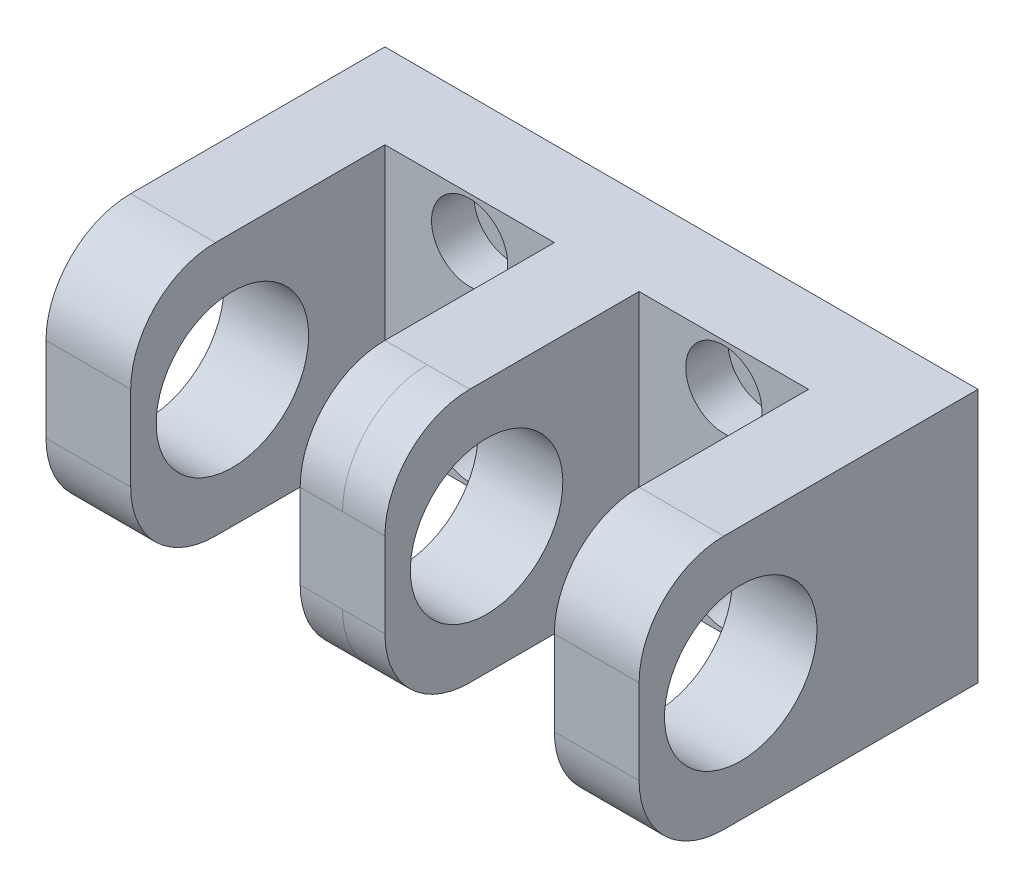
ISO-10303-21;
HEADER;
FILE_DESCRIPTION(('STEP AP214'),'2;1');
FILE_NAME('part.step','',(''),(''),'','','');
FILE_SCHEMA(('AUTOMOTIVE_DESIGN { 1 0 10303 214 1 1 1 1 }'));
ENDSEC;
DATA;
#1=APPLICATION_CONTEXT('core data for automotive mechanical design processes');
#2=APPLICATION_PROTOCOL_DEFINITION('international standard','automotive_design',2000,#1);
#3=PRODUCT_CONTEXT('',#1,'mechanical');
#4=PRODUCT('Part','Part','',(#3));
#5=PRODUCT_RELATED_PRODUCT_CATEGORY('part','',(#4));
#6=PRODUCT_DEFINITION_FORMATION('','',#4);
#7=PRODUCT_DEFINITION_CONTEXT('part definition',#1,'design');
#8=PRODUCT_DEFINITION('design','',#6,#7);
#9=PRODUCT_DEFINITION_SHAPE('','',#8);
#10=(LENGTH_UNIT() NAMED_UNIT(*) SI_UNIT(.MILLI.,.METRE.));
#11=(NAMED_UNIT(*) PLANE_ANGLE_UNIT() SI_UNIT($,.RADIAN.));
#12=(NAMED_UNIT(*) SI_UNIT($,.STERADIAN.) SOLID_ANGLE_UNIT());
#13=UNCERTAINTY_MEASURE_WITH_UNIT(LENGTH_MEASURE(1.E-05),#10,'distance_accuracy_value','');
#14=(GEOMETRIC_REPRESENTATION_CONTEXT(3) GLOBAL_UNCERTAINTY_ASSIGNED_CONTEXT((#13)) GLOBAL_UNIT_ASSIGNED_CONTEXT((#10,
#11,#12)) REPRESENTATION_CONTEXT('',''));
#15=CARTESIAN_POINT('',(0.,0.,0.));
#16=DIRECTION('',(0.,0.,1.));
#17=DIRECTION('',(1.,0.,0.));
#18=AXIS2_PLACEMENT_3D('',#15,#16,#17);
#19=CARTESIAN_POINT('',(-15.,25.,0.));
#20=DIRECTION('',(0.,0.,1.));
#21=DIRECTION('',(1.,0.,0.));
#22=AXIS2_PLACEMENT_3D('',#19,#20,#21);
#23=CYLINDRICAL_SURFACE('',#22,2.5);
#24=CARTESIAN_POINT('',(-15.,25.,0.));
#25=DIRECTION('',(0.,0.,1.));
#26=DIRECTION('',(1.,0.,0.));
#27=AXIS2_PLACEMENT_3D('',#24,#25,#26);
#28=CIRCLE('',#27,2.5);
#29=CARTESIAN_POINT('',(-12.5,25.,0.));
#30=VERTEX_POINT('',#29);
#31=EDGE_CURVE('E772',#30,#30,#28,.T.);
#32=ORIENTED_EDGE('',*,*,#31,.F.);
#33=EDGE_LOOP('',(#32));
#34=FACE_BOUND('',#33,.T.);
#35=CARTESIAN_POINT('',(-15.,25.,5.));
#36=DIRECTION('',(0.,0.,1.));
#37=DIRECTION('',(1.,0.,0.));
#38=AXIS2_PLACEMENT_3D('',#35,#36,#37);
#39=CIRCLE('',#38,2.5);
#40=CARTESIAN_POINT('',(-12.5,25.,5.));
#41=VERTEX_POINT('',#40);
#42=EDGE_CURVE('E750',#41,#41,#39,.T.);
#43=ORIENTED_EDGE('',*,*,#42,.T.);
#44=EDGE_LOOP('',(#43));
#45=FACE_BOUND('',#44,.T.);
#46=ADVANCED_FACE('F45',(#34,#45),#23,.F.);
#47=CARTESIAN_POINT('',(-15.,5.,0.));
#48=DIRECTION('',(0.,0.,1.));
#49=DIRECTION('',(1.,0.,0.));
#50=AXIS2_PLACEMENT_3D('',#47,#48,#49);
#51=CYLINDRICAL_SURFACE('',#50,2.5);
#52=CARTESIAN_POINT('',(-15.,5.,0.));
#53=DIRECTION('',(0.,0.,1.));
#54=DIRECTION('',(1.,0.,0.));
#55=AXIS2_PLACEMENT_3D('',#52,#53,#54);
#56=CIRCLE('',#55,2.5);
#57=CARTESIAN_POINT('',(-12.5,5.,0.));
#58=VERTEX_POINT('',#57);
#59=EDGE_CURVE('E755',#58,#58,#56,.T.);
#60=ORIENTED_EDGE('',*,*,#59,.F.);
#61=EDGE_LOOP('',(#60));
#62=FACE_BOUND('',#61,.T.);
#63=CARTESIAN_POINT('',(-15.,5.,5.));
#64=DIRECTION('',(0.,0.,1.));
#65=DIRECTION('',(1.,0.,0.));
#66=AXIS2_PLACEMENT_3D('',#63,#64,#65);
#67=CIRCLE('',#66,2.5);
#68=CARTESIAN_POINT('',(-12.5,5.,5.));
#69=VERTEX_POINT('',#68);
#70=EDGE_CURVE('E816',#69,#69,#67,.T.);
#71=ORIENTED_EDGE('',*,*,#70,.T.);
#72=EDGE_LOOP('',(#71));
#73=FACE_BOUND('',#72,.T.);
#74=ADVANCED_FACE('F491',(#62,#73),#51,.F.);
#75=CARTESIAN_POINT('',(15.,25.,0.));
#76=DIRECTION('',(0.,0.,1.));
#77=DIRECTION('',(1.,0.,0.));
#78=AXIS2_PLACEMENT_3D('',#75,#76,#77);
#79=CYLINDRICAL_SURFACE('',#78,2.5);
#80=CARTESIAN_POINT('',(15.,25.,0.));
#81=DIRECTION('',(0.,0.,1.));
#82=DIRECTION('',(1.,0.,0.));
#83=AXIS2_PLACEMENT_3D('',#80,#81,#82);
#84=CIRCLE('',#83,2.5);
#85=CARTESIAN_POINT('',(17.5,25.,0.));
#86=VERTEX_POINT('',#85);
#87=EDGE_CURVE('E768',#86,#86,#84,.T.);
#88=ORIENTED_EDGE('',*,*,#87,.F.);
#89=EDGE_LOOP('',(#88));
#90=FACE_BOUND('',#89,.T.);
#91=CARTESIAN_POINT('',(15.,25.,5.));
#92=DIRECTION('',(0.,0.,1.));
#93=DIRECTION('',(1.,0.,0.));
#94=AXIS2_PLACEMENT_3D('',#91,#92,#93);
#95=CIRCLE('',#94,2.5);
#96=CARTESIAN_POINT('',(17.5,25.,5.));
#97=VERTEX_POINT('',#96);
#98=EDGE_CURVE('E835',#97,#97,#95,.T.);
#99=ORIENTED_EDGE('',*,*,#98,.T.);
#100=EDGE_LOOP('',(#99));
#101=FACE_BOUND('',#100,.T.);
#102=ADVANCED_FACE('F498',(#90,#101),#79,.F.);
#103=CARTESIAN_POINT('',(15.,5.,0.));
#104=DIRECTION('',(0.,0.,1.));
#105=DIRECTION('',(1.,0.,0.));
#106=AXIS2_PLACEMENT_3D('',#103,#104,#105);
#107=CYLINDRICAL_SURFACE('',#106,2.5);
#108=CARTESIAN_POINT('',(15.,5.,0.));
#109=DIRECTION('',(0.,0.,1.));
#110=DIRECTION('',(1.,0.,0.));
#111=AXIS2_PLACEMENT_3D('',#108,#109,#110);
#112=CIRCLE('',#111,2.5);
#113=CARTESIAN_POINT('',(17.5,5.,0.));
#114=VERTEX_POINT('',#113);
#115=EDGE_CURVE('E761',#114,#114,#112,.T.);
#116=ORIENTED_EDGE('',*,*,#115,.F.);
#117=EDGE_LOOP('',(#116));
#118=FACE_BOUND('',#117,.T.);
#119=CARTESIAN_POINT('',(15.,5.,5.));
#120=DIRECTION('',(0.,0.,1.));
#121=DIRECTION('',(1.,0.,0.));
#122=AXIS2_PLACEMENT_3D('',#119,#120,#121);
#123=CIRCLE('',#122,2.5);
#124=CARTESIAN_POINT('',(17.5,5.,5.));
#125=VERTEX_POINT('',#124);
#126=EDGE_CURVE('E797',#125,#125,#123,.T.);
#127=ORIENTED_EDGE('',*,*,#126,.T.);
#128=EDGE_LOOP('',(#127));
#129=FACE_BOUND('',#128,.T.);
#130=ADVANCED_FACE('F536',(#118,#129),#107,.F.);
#131=CARTESIAN_POINT('',(0.,0.,10.));
#132=DIRECTION('',(0.,0.,-1.));
#133=DIRECTION('',(-1.,0.,0.));
#134=AXIS2_PLACEMENT_3D('',#131,#132,#133);
#135=PLANE('',#134);
#136=CARTESIAN_POINT('',(15.,5.,10.));
#137=DIRECTION('',(0.,0.,1.));
#138=DIRECTION('',(1.,0.,0.));
#139=AXIS2_PLACEMENT_3D('',#136,#137,#138);
#140=CIRCLE('',#139,4.5);
#141=CARTESIAN_POINT('',(19.5,5.,10.));
#142=VERTEX_POINT('',#141);
#143=EDGE_CURVE('E800',#142,#142,#140,.T.);
#144=ORIENTED_EDGE('',*,*,#143,.F.);
#145=EDGE_LOOP('',(#144));
#146=FACE_BOUND('',#145,.T.);
#147=CARTESIAN_POINT('',(15.,25.,10.));
#148=DIRECTION('',(0.,0.,1.));
#149=DIRECTION('',(1.,0.,0.));
#150=AXIS2_PLACEMENT_3D('',#147,#148,#149);
#151=CIRCLE('',#150,4.5);
#152=CARTESIAN_POINT('',(19.5,25.,10.));
#153=VERTEX_POINT('',#152);
#154=EDGE_CURVE('E805',#153,#153,#151,.T.);
#155=ORIENTED_EDGE('',*,*,#154,.F.);
#156=EDGE_LOOP('',(#155));
#157=FACE_BOUND('',#156,.T.);
#158=DIRECTION('',(0.,-1.,0.));
#159=VECTOR('',#158,1.);
#160=CARTESIAN_POINT('',(25.,0.,10.));
#161=LINE('',#160,#159);
#162=CARTESIAN_POINT('',(25.,30.,10.));
#163=VERTEX_POINT('',#162);
#164=CARTESIAN_POINT('',(25.,0.,10.));
#165=VERTEX_POINT('',#164);
#166=EDGE_CURVE('E251',#163,#165,#161,.T.);
#167=ORIENTED_EDGE('',*,*,#166,.F.);
#168=DIRECTION('',(-1.,0.,0.));
#169=VECTOR('',#168,1.);
#170=CARTESIAN_POINT('',(0.,30.,10.));
#171=LINE('',#170,#169);
#172=CARTESIAN_POINT('',(5.,30.,10.));
#173=VERTEX_POINT('',#172);
#174=EDGE_CURVE('E281',#163,#173,#171,.T.);
#175=ORIENTED_EDGE('',*,*,#174,.T.);
#176=DIRECTION('',(0.,1.,0.));
#177=VECTOR('',#176,1.);
#178=CARTESIAN_POINT('',(5.,30.,10.));
#179=LINE('',#178,#177);
#180=CARTESIAN_POINT('',(5.,0.,10.));
#181=VERTEX_POINT('',#180);
#182=EDGE_CURVE('E255',#181,#173,#179,.T.);
#183=ORIENTED_EDGE('',*,*,#182,.F.);
#184=DIRECTION('',(1.,0.,0.));
#185=VECTOR('',#184,1.);
#186=CARTESIAN_POINT('',(0.,0.,10.));
#187=LINE('',#186,#185);
#188=EDGE_CURVE('E277',#181,#165,#187,.T.);
#189=ORIENTED_EDGE('',*,*,#188,.T.);
#190=EDGE_LOOP('',(#167,#175,#183,#189));
#191=FACE_BOUND('',#190,.T.);
#192=ADVANCED_FACE('F437',(#146,#157,#191),#135,.F.);
#193=CARTESIAN_POINT('',(0.,0.,10.));
#194=DIRECTION('',(0.,1.,0.));
#195=DIRECTION('',(0.,0.,1.));
#196=AXIS2_PLACEMENT_3D('',#193,#194,#195);
#197=PLANE('',#196);
#198=DIRECTION('',(0.,0.,-1.));
#199=VECTOR('',#198,1.);
#200=CARTESIAN_POINT('',(-25.,0.,40.));
#201=LINE('',#200,#199);
#202=CARTESIAN_POINT('',(-25.,0.,30.));
#203=VERTEX_POINT('',#202);
#204=CARTESIAN_POINT('',(-25.,0.,10.));
#205=VERTEX_POINT('',#204);
#206=EDGE_CURVE('E185',#203,#205,#201,.T.);
#207=ORIENTED_EDGE('',*,*,#206,.F.);
#208=DIRECTION('',(-1.,0.,0.));
#209=VECTOR('',#208,1.);
#210=CARTESIAN_POINT('',(-35.,0.,30.));
#211=LINE('',#210,#209);
#212=CARTESIAN_POINT('',(-35.,0.,30.));
#213=VERTEX_POINT('',#212);
#214=EDGE_CURVE('E365',#203,#213,#211,.T.);
#215=ORIENTED_EDGE('',*,*,#214,.T.);
#216=DIRECTION('',(0.,0.,-1.));
#217=VECTOR('',#216,1.);
#218=CARTESIAN_POINT('',(-35.,0.,10.));
#219=LINE('',#218,#217);
#220=CARTESIAN_POINT('',(-35.,0.,0.));
#221=VERTEX_POINT('',#220);
#222=EDGE_CURVE('E219',#213,#221,#219,.T.);
#223=ORIENTED_EDGE('',*,*,#222,.T.);
#224=DIRECTION('',(1.,0.,0.));
#225=VECTOR('',#224,1.);
#226=CARTESIAN_POINT('',(0.,0.,0.));
#227=LINE('',#226,#225);
#228=CARTESIAN_POINT('',(35.,0.,0.));
#229=VERTEX_POINT('',#228);
#230=EDGE_CURVE('E276',#221,#229,#227,.T.);
#231=ORIENTED_EDGE('',*,*,#230,.T.);
#232=DIRECTION('',(0.,0.,-1.));
#233=VECTOR('',#232,1.);
#234=CARTESIAN_POINT('',(35.,0.,10.));
#235=LINE('',#234,#233);
#236=CARTESIAN_POINT('',(35.,0.,30.));
#237=VERTEX_POINT('',#236);
#238=EDGE_CURVE('E299',#237,#229,#235,.T.);
#239=ORIENTED_EDGE('',*,*,#238,.F.);
#240=DIRECTION('',(1.,0.,0.));
#241=VECTOR('',#240,1.);
#242=CARTESIAN_POINT('',(25.,0.,30.));
#243=LINE('',#242,#241);
#244=CARTESIAN_POINT('',(25.,0.,30.));
#245=VERTEX_POINT('',#244);
#246=EDGE_CURVE('E322',#237,#245,#243,.F.);
#247=ORIENTED_EDGE('',*,*,#246,.T.);
#248=DIRECTION('',(0.,0.,-1.));
#249=VECTOR('',#248,1.);
#250=CARTESIAN_POINT('',(25.,0.,40.));
#251=LINE('',#250,#249);
#252=EDGE_CURVE('E247',#245,#165,#251,.T.);
#253=ORIENTED_EDGE('',*,*,#252,.T.);
#254=ORIENTED_EDGE('',*,*,#188,.F.);
#255=DIRECTION('',(0.,0.,-1.));
#256=VECTOR('',#255,1.);
#257=CARTESIAN_POINT('',(5.,0.,40.));
#258=LINE('',#257,#256);
#259=CARTESIAN_POINT('',(5.,0.,30.));
#260=VERTEX_POINT('',#259);
#261=EDGE_CURVE('E273',#260,#181,#258,.T.);
#262=ORIENTED_EDGE('',*,*,#261,.F.);
#263=DIRECTION('',(1.,0.,0.));
#264=VECTOR('',#263,1.);
#265=CARTESIAN_POINT('',(0.,0.,30.));
#266=LINE('',#265,#264);
#267=CARTESIAN_POINT('',(0.,0.,30.));
#268=VERTEX_POINT('',#267);
#269=EDGE_CURVE('E319',#260,#268,#266,.F.);
#270=ORIENTED_EDGE('',*,*,#269,.T.);
#271=DIRECTION('',(-1.,0.,0.));
#272=VECTOR('',#271,1.);
#273=CARTESIAN_POINT('',(-5.,0.,30.));
#274=LINE('',#273,#272);
#275=CARTESIAN_POINT('',(-5.,0.,30.));
#276=VERTEX_POINT('',#275);
#277=EDGE_CURVE('E357',#268,#276,#274,.T.);
#278=ORIENTED_EDGE('',*,*,#277,.T.);
#279=DIRECTION('',(0.,0.,-1.));
#280=VECTOR('',#279,1.);
#281=CARTESIAN_POINT('',(-5.,0.,40.));
#282=LINE('',#281,#280);
#283=CARTESIAN_POINT('',(-5.,0.,10.));
#284=VERTEX_POINT('',#283);
#285=EDGE_CURVE('E216',#276,#284,#282,.T.);
#286=ORIENTED_EDGE('',*,*,#285,.T.);
#287=DIRECTION('',(-1.,0.,0.));
#288=VECTOR('',#287,1.);
#289=CARTESIAN_POINT('',(0.,0.,10.));
#290=LINE('',#289,#288);
#291=EDGE_CURVE('E206',#284,#205,#290,.T.);
#292=ORIENTED_EDGE('',*,*,#291,.T.);
#293=EDGE_LOOP('',(#207,#215,#223,#231,#239,#247,#253,#254,#262,#270,#278,#286,#292));
#294=FACE_BOUND('',#293,.T.);
#295=ADVANCED_FACE('F213',(#294),#197,.F.);
#296=CARTESIAN_POINT('',(35.,0.,10.));
#297=DIRECTION('',(-1.,0.,0.));
#298=DIRECTION('',(0.,0.,1.));
#299=AXIS2_PLACEMENT_3D('',#296,#297,#298);
#300=PLANE('',#299);
#301=CARTESIAN_POINT('',(35.,15.,28.));
#302=DIRECTION('',(1.,0.,0.));
#303=DIRECTION('',(0.,0.,-1.));
#304=AXIS2_PLACEMENT_3D('',#301,#302,#303);
#305=CIRCLE('',#304,9.00000000000001);
#306=CARTESIAN_POINT('',(35.,15.,19.));
#307=VERTEX_POINT('',#306);
#308=EDGE_CURVE('E235',#307,#307,#305,.T.);
#309=ORIENTED_EDGE('',*,*,#308,.F.);
#310=EDGE_LOOP('',(#309));
#311=FACE_BOUND('',#310,.T.);
#312=DIRECTION('',(0.,1.,0.));
#313=VECTOR('',#312,1.);
#314=CARTESIAN_POINT('',(35.,0.,40.));
#315=LINE('',#314,#313);
#316=CARTESIAN_POINT('',(35.,10.,40.));
#317=VERTEX_POINT('',#316);
#318=CARTESIAN_POINT('',(35.,20.,40.));
#319=VERTEX_POINT('',#318);
#320=EDGE_CURVE('E256',#317,#319,#315,.T.);
#321=ORIENTED_EDGE('',*,*,#320,.F.);
#322=CARTESIAN_POINT('',(35.,10.,30.));
#323=DIRECTION('',(-1.,0.,0.));
#324=DIRECTION('',(0.,0.,1.));
#325=AXIS2_PLACEMENT_3D('',#322,#323,#324);
#326=CIRCLE('',#325,10.);
#327=EDGE_CURVE('E316',#317,#237,#326,.F.);
#328=ORIENTED_EDGE('',*,*,#327,.T.);
#329=ORIENTED_EDGE('',*,*,#238,.T.);
#330=DIRECTION('',(0.,1.,0.));
#331=VECTOR('',#330,1.);
#332=CARTESIAN_POINT('',(35.,0.,0.));
#333=LINE('',#332,#331);
#334=CARTESIAN_POINT('',(35.,30.,0.));
#335=VERTEX_POINT('',#334);
#336=EDGE_CURVE('E290',#229,#335,#333,.T.);
#337=ORIENTED_EDGE('',*,*,#336,.T.);
#338=DIRECTION('',(0.,0.,-1.));
#339=VECTOR('',#338,1.);
#340=CARTESIAN_POINT('',(35.,30.,10.));
#341=LINE('',#340,#339);
#342=CARTESIAN_POINT('',(35.,30.,30.));
#343=VERTEX_POINT('',#342);
#344=EDGE_CURVE('E286',#343,#335,#341,.T.);
#345=ORIENTED_EDGE('',*,*,#344,.F.);
#346=CARTESIAN_POINT('',(35.,20.,30.));
#347=DIRECTION('',(-1.,0.,0.));
#348=DIRECTION('',(0.,0.,1.));
#349=AXIS2_PLACEMENT_3D('',#346,#347,#348);
#350=CIRCLE('',#349,10.);
#351=EDGE_CURVE('E313',#343,#319,#350,.F.);
#352=ORIENTED_EDGE('',*,*,#351,.T.);
#353=EDGE_LOOP('',(#321,#328,#329,#337,#345,#352));
#354=FACE_BOUND('',#353,.T.);
#355=ADVANCED_FACE('F452',(#311,#354),#300,.F.);
#356=CARTESIAN_POINT('',(0.,30.,10.));
#357=DIRECTION('',(0.,-1.,0.));
#358=DIRECTION('',(0.,0.,-1.));
#359=AXIS2_PLACEMENT_3D('',#356,#357,#358);
#360=PLANE('',#359);
#361=DIRECTION('',(0.,0.,-1.));
#362=VECTOR('',#361,1.);
#363=CARTESIAN_POINT('',(-5.,30.,40.));
#364=LINE('',#363,#362);
#365=CARTESIAN_POINT('',(-5.,30.,30.));
#366=VERTEX_POINT('',#365);
#367=CARTESIAN_POINT('',(-5.,30.,10.));
#368=VERTEX_POINT('',#367);
#369=EDGE_CURVE('E231',#366,#368,#364,.T.);
#370=ORIENTED_EDGE('',*,*,#369,.F.);
#371=DIRECTION('',(1.,0.,0.));
#372=VECTOR('',#371,1.);
#373=CARTESIAN_POINT('',(0.,30.,30.));
#374=LINE('',#373,#372);
#375=CARTESIAN_POINT('',(0.,30.,30.));
#376=VERTEX_POINT('',#375);
#377=EDGE_CURVE('E11',#366,#376,#374,.T.);
#378=ORIENTED_EDGE('',*,*,#377,.T.);
#379=DIRECTION('',(-1.,0.,0.));
#380=VECTOR('',#379,1.);
#381=CARTESIAN_POINT('',(5.,30.,30.));
#382=LINE('',#381,#380);
#383=CARTESIAN_POINT('',(5.,30.,30.));
#384=VERTEX_POINT('',#383);
#385=EDGE_CURVE('E354',#376,#384,#382,.F.);
#386=ORIENTED_EDGE('',*,*,#385,.T.);
#387=DIRECTION('',(0.,0.,-1.));
#388=VECTOR('',#387,1.);
#389=CARTESIAN_POINT('',(5.,30.,40.));
#390=LINE('',#389,#388);
#391=EDGE_CURVE('E267',#384,#173,#390,.T.);
#392=ORIENTED_EDGE('',*,*,#391,.T.);
#393=ORIENTED_EDGE('',*,*,#174,.F.);
#394=DIRECTION('',(0.,0.,-1.));
#395=VECTOR('',#394,1.);
#396=CARTESIAN_POINT('',(25.,30.,40.));
#397=LINE('',#396,#395);
#398=CARTESIAN_POINT('',(25.,30.,30.));
#399=VERTEX_POINT('',#398);
#400=EDGE_CURVE('E244',#399,#163,#397,.T.);
#401=ORIENTED_EDGE('',*,*,#400,.F.);
#402=DIRECTION('',(-1.,0.,0.));
#403=VECTOR('',#402,1.);
#404=CARTESIAN_POINT('',(35.,30.,30.));
#405=LINE('',#404,#403);
#406=EDGE_CURVE('E351',#399,#343,#405,.F.);
#407=ORIENTED_EDGE('',*,*,#406,.T.);
#408=ORIENTED_EDGE('',*,*,#344,.T.);
#409=DIRECTION('',(-1.,0.,0.));
#410=VECTOR('',#409,1.);
#411=CARTESIAN_POINT('',(0.,30.,0.));
#412=LINE('',#411,#410);
#413=CARTESIAN_POINT('',(-35.,30.,0.));
#414=VERTEX_POINT('',#413);
#415=EDGE_CURVE('E282',#335,#414,#412,.T.);
#416=ORIENTED_EDGE('',*,*,#415,.T.);
#417=DIRECTION('',(0.,0.,-1.));
#418=VECTOR('',#417,1.);
#419=CARTESIAN_POINT('',(-35.,30.,10.));
#420=LINE('',#419,#418);
#421=CARTESIAN_POINT('',(-35.,30.,30.));
#422=VERTEX_POINT('',#421);
#423=EDGE_CURVE('E223',#422,#414,#420,.T.);
#424=ORIENTED_EDGE('',*,*,#423,.F.);
#425=DIRECTION('',(1.,0.,0.));
#426=VECTOR('',#425,1.);
#427=CARTESIAN_POINT('',(-25.,30.,30.));
#428=LINE('',#427,#426);
#429=CARTESIAN_POINT('',(-25.,30.,30.));
#430=VERTEX_POINT('',#429);
#431=EDGE_CURVE('E54',#422,#430,#428,.T.);
#432=ORIENTED_EDGE('',*,*,#431,.T.);
#433=DIRECTION('',(0.,0.,-1.));
#434=VECTOR('',#433,1.);
#435=CARTESIAN_POINT('',(-25.,30.,40.));
#436=LINE('',#435,#434);
#437=CARTESIAN_POINT('',(-25.,30.,10.));
#438=VERTEX_POINT('',#437);
#439=EDGE_CURVE('E200',#430,#438,#436,.T.);
#440=ORIENTED_EDGE('',*,*,#439,.T.);
#441=DIRECTION('',(1.,0.,0.));
#442=VECTOR('',#441,1.);
#443=CARTESIAN_POINT('',(0.,30.,10.));
#444=LINE('',#443,#442);
#445=EDGE_CURVE('E208',#438,#368,#444,.T.);
#446=ORIENTED_EDGE('',*,*,#445,.T.);
#447=EDGE_LOOP('',(#370,#378,#386,#392,#393,#401,#407,#408,#416,#424,#432,#440,#446));
#448=FACE_BOUND('',#447,.T.);
#449=ADVANCED_FACE('F399',(#448),#360,.F.);
#450=CARTESIAN_POINT('',(0.,0.,0.));
#451=DIRECTION('',(0.,0.,-1.));
#452=DIRECTION('',(-1.,0.,0.));
#453=AXIS2_PLACEMENT_3D('',#450,#451,#452);
#454=PLANE('',#453);
#455=ORIENTED_EDGE('',*,*,#59,.T.);
#456=EDGE_LOOP('',(#455));
#457=FACE_BOUND('',#456,.T.);
#458=ORIENTED_EDGE('',*,*,#115,.T.);
#459=EDGE_LOOP('',(#458));
#460=FACE_BOUND('',#459,.T.);
#461=ORIENTED_EDGE('',*,*,#87,.T.);
#462=EDGE_LOOP('',(#461));
#463=FACE_BOUND('',#462,.T.);
#464=ORIENTED_EDGE('',*,*,#31,.T.);
#465=EDGE_LOOP('',(#464));
#466=FACE_BOUND('',#465,.T.);
#467=ORIENTED_EDGE('',*,*,#230,.F.);
#468=DIRECTION('',(0.,1.,0.));
#469=VECTOR('',#468,1.);
#470=CARTESIAN_POINT('',(-35.,0.,0.));
#471=LINE('',#470,#469);
#472=EDGE_CURVE('E225',#221,#414,#471,.T.);
#473=ORIENTED_EDGE('',*,*,#472,.T.);
#474=ORIENTED_EDGE('',*,*,#415,.F.);
#475=ORIENTED_EDGE('',*,*,#336,.F.);
#476=EDGE_LOOP('',(#467,#473,#474,#475));
#477=FACE_BOUND('',#476,.T.);
#478=ADVANCED_FACE('F466',(#457,#460,#463,#466,#477),#454,.T.);
#479=CARTESIAN_POINT('',(5.,30.,40.));
#480=DIRECTION('',(-1.,0.,0.));
#481=DIRECTION('',(0.,-1.,0.));
#482=AXIS2_PLACEMENT_3D('',#479,#480,#481);
#483=PLANE('',#482);
#484=CARTESIAN_POINT('',(5.,15.,28.));
#485=DIRECTION('',(-1.,0.,0.));
#486=DIRECTION('',(0.,-1.,0.));
#487=AXIS2_PLACEMENT_3D('',#484,#485,#486);
#488=CIRCLE('',#487,9.00000000000001);
#489=CARTESIAN_POINT('',(5.,5.99999999999999,28.));
#490=VERTEX_POINT('',#489);
#491=EDGE_CURVE('E240',#490,#490,#488,.T.);
#492=ORIENTED_EDGE('',*,*,#491,.T.);
#493=EDGE_LOOP('',(#492));
#494=FACE_BOUND('',#493,.T.);
#495=DIRECTION('',(0.,1.,0.));
#496=VECTOR('',#495,1.);
#497=CARTESIAN_POINT('',(5.,30.,40.));
#498=LINE('',#497,#496);
#499=CARTESIAN_POINT('',(5.,10.,40.));
#500=VERTEX_POINT('',#499);
#501=CARTESIAN_POINT('',(5.,20.,40.));
#502=VERTEX_POINT('',#501);
#503=EDGE_CURVE('E263',#500,#502,#498,.T.);
#504=ORIENTED_EDGE('',*,*,#503,.F.);
#505=CARTESIAN_POINT('',(5.,10.,30.));
#506=DIRECTION('',(-1.,0.,0.));
#507=DIRECTION('',(0.,-1.,0.));
#508=AXIS2_PLACEMENT_3D('',#505,#506,#507);
#509=CIRCLE('',#508,10.);
#510=EDGE_CURVE('E341',#500,#260,#509,.F.);
#511=ORIENTED_EDGE('',*,*,#510,.T.);
#512=ORIENTED_EDGE('',*,*,#261,.T.);
#513=ORIENTED_EDGE('',*,*,#182,.T.);
#514=ORIENTED_EDGE('',*,*,#391,.F.);
#515=CARTESIAN_POINT('',(5.,20.,30.));
#516=DIRECTION('',(-1.,0.,0.));
#517=DIRECTION('',(0.,-1.,0.));
#518=AXIS2_PLACEMENT_3D('',#515,#516,#517);
#519=CIRCLE('',#518,10.);
#520=EDGE_CURVE('E338',#384,#502,#519,.F.);
#521=ORIENTED_EDGE('',*,*,#520,.T.);
#522=EDGE_LOOP('',(#504,#511,#512,#513,#514,#521));
#523=FACE_BOUND('',#522,.T.);
#524=ADVANCED_FACE('F429',(#494,#523),#483,.F.);
#525=CARTESIAN_POINT('',(0.,0.,40.));
#526=DIRECTION('',(0.,0.,1.));
#527=DIRECTION('',(1.,0.,0.));
#528=AXIS2_PLACEMENT_3D('',#525,#526,#527);
#529=PLANE('',#528);
#530=DIRECTION('',(0.,1.,0.));
#531=VECTOR('',#530,1.);
#532=CARTESIAN_POINT('',(-5.,30.,40.));
#533=LINE('',#532,#531);
#534=CARTESIAN_POINT('',(-5.,10.,40.));
#535=VERTEX_POINT('',#534);
#536=CARTESIAN_POINT('',(-5.,20.,40.));
#537=VERTEX_POINT('',#536);
#538=EDGE_CURVE('E409',#535,#537,#533,.T.);
#539=ORIENTED_EDGE('',*,*,#538,.F.);
#540=DIRECTION('',(-1.,0.,0.));
#541=VECTOR('',#540,1.);
#542=CARTESIAN_POINT('',(0.,10.,40.));
#543=LINE('',#542,#541);
#544=CARTESIAN_POINT('',(0.,10.,40.));
#545=VERTEX_POINT('',#544);
#546=EDGE_CURVE('E392',#535,#545,#543,.F.);
#547=ORIENTED_EDGE('',*,*,#546,.T.);
#548=DIRECTION('',(1.,0.,0.));
#549=VECTOR('',#548,1.);
#550=CARTESIAN_POINT('',(5.,10.,40.));
#551=LINE('',#550,#549);
#552=EDGE_CURVE('E334',#545,#500,#551,.T.);
#553=ORIENTED_EDGE('',*,*,#552,.T.);
#554=ORIENTED_EDGE('',*,*,#503,.T.);
#555=DIRECTION('',(-1.,0.,0.));
#556=VECTOR('',#555,1.);
#557=CARTESIAN_POINT('',(0.,20.,40.));
#558=LINE('',#557,#556);
#559=CARTESIAN_POINT('',(0.,20.,40.));
#560=VERTEX_POINT('',#559);
#561=EDGE_CURVE('E331',#502,#560,#558,.T.);
#562=ORIENTED_EDGE('',*,*,#561,.T.);
#563=DIRECTION('',(1.,0.,0.));
#564=VECTOR('',#563,1.);
#565=CARTESIAN_POINT('',(-5.,20.,40.));
#566=LINE('',#565,#564);
#567=EDGE_CURVE('E69',#560,#537,#566,.F.);
#568=ORIENTED_EDGE('',*,*,#567,.T.);
#569=EDGE_LOOP('',(#539,#547,#553,#554,#562,#568));
#570=FACE_BOUND('',#569,.T.);
#571=ADVANCED_FACE('F425',(#570),#529,.T.);
#572=CARTESIAN_POINT('',(25.,0.,40.));
#573=DIRECTION('',(1.,0.,0.));
#574=DIRECTION('',(0.,0.,-1.));
#575=AXIS2_PLACEMENT_3D('',#572,#573,#574);
#576=PLANE('',#575);
#577=CARTESIAN_POINT('',(25.,15.,28.));
#578=DIRECTION('',(1.,0.,0.));
#579=DIRECTION('',(0.,0.,-1.));
#580=AXIS2_PLACEMENT_3D('',#577,#578,#579);
#581=CIRCLE('',#580,9.00000000000001);
#582=CARTESIAN_POINT('',(25.,15.,19.));
#583=VERTEX_POINT('',#582);
#584=EDGE_CURVE('E239',#583,#583,#581,.T.);
#585=ORIENTED_EDGE('',*,*,#584,.T.);
#586=EDGE_LOOP('',(#585));
#587=FACE_BOUND('',#586,.T.);
#588=ORIENTED_EDGE('',*,*,#252,.F.);
#589=CARTESIAN_POINT('',(25.,10.,30.));
#590=DIRECTION('',(1.,0.,0.));
#591=DIRECTION('',(0.,0.,-1.));
#592=AXIS2_PLACEMENT_3D('',#589,#590,#591);
#593=CIRCLE('',#592,10.);
#594=CARTESIAN_POINT('',(25.,10.,40.));
#595=VERTEX_POINT('',#594);
#596=EDGE_CURVE('E328',#245,#595,#593,.F.);
#597=ORIENTED_EDGE('',*,*,#596,.T.);
#598=DIRECTION('',(0.,-1.,0.));
#599=VECTOR('',#598,1.);
#600=CARTESIAN_POINT('',(25.,0.,40.));
#601=LINE('',#600,#599);
#602=CARTESIAN_POINT('',(25.,20.,40.));
#603=VERTEX_POINT('',#602);
#604=EDGE_CURVE('E250',#603,#595,#601,.T.);
#605=ORIENTED_EDGE('',*,*,#604,.F.);
#606=CARTESIAN_POINT('',(25.,20.,30.));
#607=DIRECTION('',(1.,0.,0.));
#608=DIRECTION('',(0.,0.,-1.));
#609=AXIS2_PLACEMENT_3D('',#606,#607,#608);
#610=CIRCLE('',#609,10.);
#611=EDGE_CURVE('E325',#603,#399,#610,.F.);
#612=ORIENTED_EDGE('',*,*,#611,.T.);
#613=ORIENTED_EDGE('',*,*,#400,.T.);
#614=ORIENTED_EDGE('',*,*,#166,.T.);
#615=EDGE_LOOP('',(#588,#597,#605,#612,#613,#614));
#616=FACE_BOUND('',#615,.T.);
#617=ADVANCED_FACE('F441',(#587,#616),#576,.F.);
#618=CARTESIAN_POINT('',(0.,0.,40.));
#619=DIRECTION('',(0.,0.,1.));
#620=DIRECTION('',(1.,0.,0.));
#621=AXIS2_PLACEMENT_3D('',#618,#619,#620);
#622=PLANE('',#621);
#623=ORIENTED_EDGE('',*,*,#604,.T.);
#624=DIRECTION('',(1.,0.,0.));
#625=VECTOR('',#624,1.);
#626=CARTESIAN_POINT('',(35.,10.,40.));
#627=LINE('',#626,#625);
#628=EDGE_CURVE('E309',#595,#317,#627,.T.);
#629=ORIENTED_EDGE('',*,*,#628,.T.);
#630=ORIENTED_EDGE('',*,*,#320,.T.);
#631=DIRECTION('',(-1.,0.,0.));
#632=VECTOR('',#631,1.);
#633=CARTESIAN_POINT('',(25.,20.,40.));
#634=LINE('',#633,#632);
#635=EDGE_CURVE('E302',#319,#603,#634,.T.);
#636=ORIENTED_EDGE('',*,*,#635,.T.);
#637=EDGE_LOOP('',(#623,#629,#630,#636));
#638=FACE_BOUND('',#637,.T.);
#639=ADVANCED_FACE('F454',(#638),#622,.T.);
#640=CARTESIAN_POINT('',(0.,15.,28.));
#641=DIRECTION('',(1.,0.,0.));
#642=DIRECTION('',(0.,0.,-1.));
#643=AXIS2_PLACEMENT_3D('',#640,#641,#642);
#644=CYLINDRICAL_SURFACE('',#643,9.00000000000001);
#645=ORIENTED_EDGE('',*,*,#308,.T.);
#646=EDGE_LOOP('',(#645));
#647=FACE_BOUND('',#646,.T.);
#648=ORIENTED_EDGE('',*,*,#584,.F.);
#649=EDGE_LOOP('',(#648));
#650=FACE_BOUND('',#649,.T.);
#651=ADVANCED_FACE('F522',(#647,#650),#644,.F.);
#652=ORIENTED_EDGE('',*,*,#491,.F.);
#653=EDGE_LOOP('',(#652));
#654=FACE_BOUND('',#653,.T.);
#655=CARTESIAN_POINT('',(-5.,15.,28.));
#656=DIRECTION('',(-1.,0.,0.));
#657=DIRECTION('',(0.,-1.,0.));
#658=AXIS2_PLACEMENT_3D('',#655,#656,#657);
#659=CIRCLE('',#658,9.00000000000001);
#660=CARTESIAN_POINT('',(-5.,5.99999999999999,28.));
#661=VERTEX_POINT('',#660);
#662=EDGE_CURVE('E211',#661,#661,#659,.F.);
#663=ORIENTED_EDGE('',*,*,#662,.F.);
#664=EDGE_LOOP('',(#663));
#665=FACE_BOUND('',#664,.T.);
#666=ADVANCED_FACE('F519',(#654,#665),#644,.F.);
#667=CARTESIAN_POINT('',(0.,10.,30.));
#668=DIRECTION('',(-1.,0.,0.));
#669=DIRECTION('',(0.,0.,1.));
#670=AXIS2_PLACEMENT_3D('',#667,#668,#669);
#671=CYLINDRICAL_SURFACE('',#670,10.);
#672=ORIENTED_EDGE('',*,*,#596,.F.);
#673=ORIENTED_EDGE('',*,*,#246,.F.);
#674=ORIENTED_EDGE('',*,*,#327,.F.);
#675=ORIENTED_EDGE('',*,*,#628,.F.);
#676=EDGE_LOOP('',(#672,#673,#674,#675));
#677=FACE_BOUND('',#676,.T.);
#678=ADVANCED_FACE('F457',(#677),#671,.T.);
#679=CARTESIAN_POINT('',(0.,10.,30.));
#680=DIRECTION('',(-1.,0.,0.));
#681=DIRECTION('',(0.,0.,1.));
#682=AXIS2_PLACEMENT_3D('',#679,#680,#681);
#683=CYLINDRICAL_SURFACE('',#682,10.);
#684=CARTESIAN_POINT('',(0.,10.,30.));
#685=DIRECTION('',(1.,0.,0.));
#686=DIRECTION('',(0.,0.,-1.));
#687=AXIS2_PLACEMENT_3D('',#684,#685,#686);
#688=CIRCLE('',#687,10.);
#689=EDGE_CURVE('E347',#268,#545,#688,.F.);
#690=ORIENTED_EDGE('',*,*,#689,.F.);
#691=ORIENTED_EDGE('',*,*,#269,.F.);
#692=ORIENTED_EDGE('',*,*,#510,.F.);
#693=ORIENTED_EDGE('',*,*,#552,.F.);
#694=EDGE_LOOP('',(#690,#691,#692,#693));
#695=FACE_BOUND('',#694,.T.);
#696=ADVANCED_FACE('F549',(#695),#683,.T.);
#697=CARTESIAN_POINT('',(0.,20.,30.));
#698=DIRECTION('',(1.,0.,0.));
#699=DIRECTION('',(0.,0.,-1.));
#700=AXIS2_PLACEMENT_3D('',#697,#698,#699);
#701=CYLINDRICAL_SURFACE('',#700,10.);
#702=ORIENTED_EDGE('',*,*,#520,.F.);
#703=ORIENTED_EDGE('',*,*,#385,.F.);
#704=CARTESIAN_POINT('',(0.,20.,30.));
#705=DIRECTION('',(1.,0.,0.));
#706=DIRECTION('',(0.,0.,-1.));
#707=AXIS2_PLACEMENT_3D('',#704,#705,#706);
#708=CIRCLE('',#707,10.);
#709=EDGE_CURVE('E344',#560,#376,#708,.F.);
#710=ORIENTED_EDGE('',*,*,#709,.F.);
#711=ORIENTED_EDGE('',*,*,#561,.F.);
#712=EDGE_LOOP('',(#702,#703,#710,#711));
#713=FACE_BOUND('',#712,.T.);
#714=ADVANCED_FACE('F424',(#713),#701,.T.);
#715=CARTESIAN_POINT('',(0.,20.,30.));
#716=DIRECTION('',(1.,0.,0.));
#717=DIRECTION('',(0.,0.,-1.));
#718=AXIS2_PLACEMENT_3D('',#715,#716,#717);
#719=CYLINDRICAL_SURFACE('',#718,10.);
#720=ORIENTED_EDGE('',*,*,#351,.F.);
#721=ORIENTED_EDGE('',*,*,#406,.F.);
#722=ORIENTED_EDGE('',*,*,#611,.F.);
#723=ORIENTED_EDGE('',*,*,#635,.F.);
#724=EDGE_LOOP('',(#720,#721,#722,#723));
#725=FACE_BOUND('',#724,.T.);
#726=ADVANCED_FACE('F448',(#725),#719,.T.);
#727=CARTESIAN_POINT('',(-35.,0.,10.));
#728=DIRECTION('',(-1.,0.,0.));
#729=DIRECTION('',(0.,0.,1.));
#730=AXIS2_PLACEMENT_3D('',#727,#728,#729);
#731=PLANE('',#730);
#732=CARTESIAN_POINT('',(-35.,15.,28.));
#733=DIRECTION('',(1.,0.,0.));
#734=DIRECTION('',(0.,0.,-1.));
#735=AXIS2_PLACEMENT_3D('',#732,#733,#734);
#736=CIRCLE('',#735,9.00000000000001);
#737=CARTESIAN_POINT('',(-35.,15.,19.));
#738=VERTEX_POINT('',#737);
#739=EDGE_CURVE('E362',#738,#738,#736,.T.);
#740=ORIENTED_EDGE('',*,*,#739,.T.);
#741=EDGE_LOOP('',(#740));
#742=FACE_BOUND('',#741,.T.);
#743=ORIENTED_EDGE('',*,*,#222,.F.);
#744=CARTESIAN_POINT('',(-35.,10.,30.));
#745=DIRECTION('',(-1.,0.,0.));
#746=DIRECTION('',(0.,0.,1.));
#747=AXIS2_PLACEMENT_3D('',#744,#745,#746);
#748=CIRCLE('',#747,10.);
#749=CARTESIAN_POINT('',(-35.,10.,40.));
#750=VERTEX_POINT('',#749);
#751=EDGE_CURVE('E371',#213,#750,#748,.T.);
#752=ORIENTED_EDGE('',*,*,#751,.T.);
#753=DIRECTION('',(0.,1.,0.));
#754=VECTOR('',#753,1.);
#755=CARTESIAN_POINT('',(-35.,0.,40.));
#756=LINE('',#755,#754);
#757=CARTESIAN_POINT('',(-35.,20.,40.));
#758=VERTEX_POINT('',#757);
#759=EDGE_CURVE('E210',#750,#758,#756,.T.);
#760=ORIENTED_EDGE('',*,*,#759,.T.);
#761=CARTESIAN_POINT('',(-35.,20.,30.));
#762=DIRECTION('',(-1.,0.,0.));
#763=DIRECTION('',(0.,0.,1.));
#764=AXIS2_PLACEMENT_3D('',#761,#762,#763);
#765=CIRCLE('',#764,10.);
#766=EDGE_CURVE('E368',#758,#422,#765,.T.);
#767=ORIENTED_EDGE('',*,*,#766,.T.);
#768=ORIENTED_EDGE('',*,*,#423,.T.);
#769=ORIENTED_EDGE('',*,*,#472,.F.);
#770=EDGE_LOOP('',(#743,#752,#760,#767,#768,#769));
#771=FACE_BOUND('',#770,.T.);
#772=ADVANCED_FACE('F468',(#742,#771),#731,.T.);
#773=CARTESIAN_POINT('',(0.,0.,10.));
#774=DIRECTION('',(0.,0.,-1.));
#775=DIRECTION('',(1.,0.,0.));
#776=AXIS2_PLACEMENT_3D('',#773,#774,#775);
#777=PLANE('',#776);
#778=CARTESIAN_POINT('',(-14.9999999999998,5.,10.));
#779=DIRECTION('',(0.,0.,1.));
#780=DIRECTION('',(1.,0.,0.));
#781=AXIS2_PLACEMENT_3D('',#778,#779,#780);
#782=CIRCLE('',#781,4.5);
#783=CARTESIAN_POINT('',(-10.4999999999998,5.,10.));
#784=VERTEX_POINT('',#783);
#785=EDGE_CURVE('E812',#784,#784,#782,.T.);
#786=ORIENTED_EDGE('',*,*,#785,.F.);
#787=EDGE_LOOP('',(#786));
#788=FACE_BOUND('',#787,.T.);
#789=CARTESIAN_POINT('',(-15.,25.,10.));
#790=DIRECTION('',(0.,0.,1.));
#791=DIRECTION('',(1.,0.,0.));
#792=AXIS2_PLACEMENT_3D('',#789,#790,#791);
#793=CIRCLE('',#792,4.5);
#794=CARTESIAN_POINT('',(-10.5,25.,10.));
#795=VERTEX_POINT('',#794);
#796=EDGE_CURVE('E756',#795,#795,#793,.T.);
#797=ORIENTED_EDGE('',*,*,#796,.F.);
#798=EDGE_LOOP('',(#797));
#799=FACE_BOUND('',#798,.T.);
#800=ORIENTED_EDGE('',*,*,#445,.F.);
#801=DIRECTION('',(0.,-1.,0.));
#802=VECTOR('',#801,1.);
#803=CARTESIAN_POINT('',(-25.,0.,10.));
#804=LINE('',#803,#802);
#805=EDGE_CURVE('E190',#438,#205,#804,.T.);
#806=ORIENTED_EDGE('',*,*,#805,.T.);
#807=ORIENTED_EDGE('',*,*,#291,.F.);
#808=DIRECTION('',(0.,1.,0.));
#809=VECTOR('',#808,1.);
#810=CARTESIAN_POINT('',(-5.,30.,10.));
#811=LINE('',#810,#809);
#812=EDGE_CURVE('E199',#284,#368,#811,.T.);
#813=ORIENTED_EDGE('',*,*,#812,.T.);
#814=EDGE_LOOP('',(#800,#806,#807,#813));
#815=FACE_BOUND('',#814,.T.);
#816=ADVANCED_FACE('F204',(#788,#799,#815),#777,.F.);
#817=CARTESIAN_POINT('',(-5.,30.,40.));
#818=DIRECTION('',(-1.,0.,0.));
#819=DIRECTION('',(0.,-1.,0.));
#820=AXIS2_PLACEMENT_3D('',#817,#818,#819);
#821=PLANE('',#820);
#822=ORIENTED_EDGE('',*,*,#662,.T.);
#823=EDGE_LOOP('',(#822));
#824=FACE_BOUND('',#823,.T.);
#825=ORIENTED_EDGE('',*,*,#285,.F.);
#826=CARTESIAN_POINT('',(-5.,10.,30.));
#827=DIRECTION('',(-1.,0.,0.));
#828=DIRECTION('',(0.,-1.,0.));
#829=AXIS2_PLACEMENT_3D('',#826,#827,#828);
#830=CIRCLE('',#829,10.);
#831=EDGE_CURVE('E387',#276,#535,#830,.T.);
#832=ORIENTED_EDGE('',*,*,#831,.T.);
#833=ORIENTED_EDGE('',*,*,#538,.T.);
#834=CARTESIAN_POINT('',(-5.,20.,30.));
#835=DIRECTION('',(-1.,0.,0.));
#836=DIRECTION('',(0.,-1.,0.));
#837=AXIS2_PLACEMENT_3D('',#834,#835,#836);
#838=CIRCLE('',#837,10.);
#839=EDGE_CURVE('E61',#537,#366,#838,.T.);
#840=ORIENTED_EDGE('',*,*,#839,.T.);
#841=ORIENTED_EDGE('',*,*,#369,.T.);
#842=ORIENTED_EDGE('',*,*,#812,.F.);
#843=EDGE_LOOP('',(#825,#832,#833,#840,#841,#842));
#844=FACE_BOUND('',#843,.T.);
#845=ADVANCED_FACE('F416',(#824,#844),#821,.T.);
#846=CARTESIAN_POINT('',(-25.,0.,40.));
#847=DIRECTION('',(1.,0.,0.));
#848=DIRECTION('',(0.,0.,-1.));
#849=AXIS2_PLACEMENT_3D('',#846,#847,#848);
#850=PLANE('',#849);
#851=CARTESIAN_POINT('',(-25.,15.,28.));
#852=DIRECTION('',(1.,0.,0.));
#853=DIRECTION('',(0.,0.,-1.));
#854=AXIS2_PLACEMENT_3D('',#851,#852,#853);
#855=CIRCLE('',#854,9.00000000000001);
#856=CARTESIAN_POINT('',(-25.,15.,19.));
#857=VERTEX_POINT('',#856);
#858=EDGE_CURVE('E358',#857,#857,#855,.F.);
#859=ORIENTED_EDGE('',*,*,#858,.T.);
#860=EDGE_LOOP('',(#859));
#861=FACE_BOUND('',#860,.T.);
#862=DIRECTION('',(0.,-1.,0.));
#863=VECTOR('',#862,1.);
#864=CARTESIAN_POINT('',(-25.,0.,40.));
#865=LINE('',#864,#863);
#866=CARTESIAN_POINT('',(-25.,20.,40.));
#867=VERTEX_POINT('',#866);
#868=CARTESIAN_POINT('',(-25.,10.,40.));
#869=VERTEX_POINT('',#868);
#870=EDGE_CURVE('E404',#867,#869,#865,.T.);
#871=ORIENTED_EDGE('',*,*,#870,.T.);
#872=CARTESIAN_POINT('',(-25.,10.,30.));
#873=DIRECTION('',(1.,0.,0.));
#874=DIRECTION('',(0.,0.,-1.));
#875=AXIS2_PLACEMENT_3D('',#872,#873,#874);
#876=CIRCLE('',#875,10.);
#877=EDGE_CURVE('E193',#869,#203,#876,.T.);
#878=ORIENTED_EDGE('',*,*,#877,.T.);
#879=ORIENTED_EDGE('',*,*,#206,.T.);
#880=ORIENTED_EDGE('',*,*,#805,.F.);
#881=ORIENTED_EDGE('',*,*,#439,.F.);
#882=CARTESIAN_POINT('',(-25.,20.,30.));
#883=DIRECTION('',(1.,0.,0.));
#884=DIRECTION('',(0.,0.,-1.));
#885=AXIS2_PLACEMENT_3D('',#882,#883,#884);
#886=CIRCLE('',#885,10.);
#887=EDGE_CURVE('E380',#430,#867,#886,.T.);
#888=ORIENTED_EDGE('',*,*,#887,.T.);
#889=EDGE_LOOP('',(#871,#878,#879,#880,#881,#888));
#890=FACE_BOUND('',#889,.T.);
#891=ADVANCED_FACE('F188',(#861,#890),#850,.T.);
#892=CARTESIAN_POINT('',(0.,0.,40.));
#893=DIRECTION('',(0.,0.,1.));
#894=DIRECTION('',(-1.,0.,0.));
#895=AXIS2_PLACEMENT_3D('',#892,#893,#894);
#896=PLANE('',#895);
#897=ORIENTED_EDGE('',*,*,#759,.F.);
#898=DIRECTION('',(-1.,0.,0.));
#899=VECTOR('',#898,1.);
#900=CARTESIAN_POINT('',(-25.,10.,40.));
#901=LINE('',#900,#899);
#902=EDGE_CURVE('E377',#750,#869,#901,.F.);
#903=ORIENTED_EDGE('',*,*,#902,.T.);
#904=ORIENTED_EDGE('',*,*,#870,.F.);
#905=DIRECTION('',(1.,0.,0.));
#906=VECTOR('',#905,1.);
#907=CARTESIAN_POINT('',(-35.,20.,40.));
#908=LINE('',#907,#906);
#909=EDGE_CURVE('E374',#867,#758,#908,.F.);
#910=ORIENTED_EDGE('',*,*,#909,.T.);
#911=EDGE_LOOP('',(#897,#903,#904,#910));
#912=FACE_BOUND('',#911,.T.);
#913=ADVANCED_FACE('F473',(#912),#896,.T.);
#914=CARTESIAN_POINT('',(35.,15.,28.));
#915=DIRECTION('',(-1.,0.,0.));
#916=DIRECTION('',(0.,0.,1.));
#917=AXIS2_PLACEMENT_3D('',#914,#915,#916);
#918=CYLINDRICAL_SURFACE('',#917,9.00000000000001);
#919=ORIENTED_EDGE('',*,*,#858,.F.);
#920=EDGE_LOOP('',(#919));
#921=FACE_BOUND('',#920,.T.);
#922=ORIENTED_EDGE('',*,*,#739,.F.);
#923=EDGE_LOOP('',(#922));
#924=FACE_BOUND('',#923,.T.);
#925=ADVANCED_FACE('F479',(#921,#924),#918,.F.);
#926=CARTESIAN_POINT('',(0.,10.,30.));
#927=DIRECTION('',(1.,0.,0.));
#928=DIRECTION('',(0.,0.,-1.));
#929=AXIS2_PLACEMENT_3D('',#926,#927,#928);
#930=CYLINDRICAL_SURFACE('',#929,10.);
#931=ORIENTED_EDGE('',*,*,#877,.F.);
#932=ORIENTED_EDGE('',*,*,#902,.F.);
#933=ORIENTED_EDGE('',*,*,#751,.F.);
#934=ORIENTED_EDGE('',*,*,#214,.F.);
#935=EDGE_LOOP('',(#931,#932,#933,#934));
#936=FACE_BOUND('',#935,.T.);
#937=ADVANCED_FACE('F476',(#936),#930,.T.);
#938=CARTESIAN_POINT('',(0.,10.,30.));
#939=DIRECTION('',(1.,0.,0.));
#940=DIRECTION('',(0.,0.,-1.));
#941=AXIS2_PLACEMENT_3D('',#938,#939,#940);
#942=CYLINDRICAL_SURFACE('',#941,10.);
#943=ORIENTED_EDGE('',*,*,#689,.T.);
#944=ORIENTED_EDGE('',*,*,#546,.F.);
#945=ORIENTED_EDGE('',*,*,#831,.F.);
#946=ORIENTED_EDGE('',*,*,#277,.F.);
#947=EDGE_LOOP('',(#943,#944,#945,#946));
#948=FACE_BOUND('',#947,.T.);
#949=ADVANCED_FACE('F478',(#948),#942,.T.);
#950=CARTESIAN_POINT('',(0.,20.,30.));
#951=DIRECTION('',(-1.,0.,0.));
#952=DIRECTION('',(0.,0.,1.));
#953=AXIS2_PLACEMENT_3D('',#950,#951,#952);
#954=CYLINDRICAL_SURFACE('',#953,10.);
#955=ORIENTED_EDGE('',*,*,#839,.F.);
#956=ORIENTED_EDGE('',*,*,#567,.F.);
#957=ORIENTED_EDGE('',*,*,#709,.T.);
#958=ORIENTED_EDGE('',*,*,#377,.F.);
#959=EDGE_LOOP('',(#955,#956,#957,#958));
#960=FACE_BOUND('',#959,.T.);
#961=ADVANCED_FACE('F420',(#960),#954,.T.);
#962=CARTESIAN_POINT('',(0.,20.,30.));
#963=DIRECTION('',(-1.,0.,0.));
#964=DIRECTION('',(0.,0.,1.));
#965=AXIS2_PLACEMENT_3D('',#962,#963,#964);
#966=CYLINDRICAL_SURFACE('',#965,10.);
#967=ORIENTED_EDGE('',*,*,#766,.F.);
#968=ORIENTED_EDGE('',*,*,#909,.F.);
#969=ORIENTED_EDGE('',*,*,#887,.F.);
#970=ORIENTED_EDGE('',*,*,#431,.F.);
#971=EDGE_LOOP('',(#967,#968,#969,#970));
#972=FACE_BOUND('',#971,.T.);
#973=ADVANCED_FACE('F47',(#972),#966,.T.);
#974=CARTESIAN_POINT('',(15.,5.,5.));
#975=DIRECTION('',(0.,0.,1.));
#976=DIRECTION('',(1.,0.,0.));
#977=AXIS2_PLACEMENT_3D('',#974,#975,#976);
#978=CYLINDRICAL_SURFACE('',#977,4.5);
#979=CARTESIAN_POINT('',(15.,5.,5.));
#980=DIRECTION('',(0.,0.,1.));
#981=DIRECTION('',(1.,0.,0.));
#982=AXIS2_PLACEMENT_3D('',#979,#980,#981);
#983=CIRCLE('',#982,4.5);
#984=CARTESIAN_POINT('',(19.5,5.,5.));
#985=VERTEX_POINT('',#984);
#986=EDGE_CURVE('E808',#985,#985,#983,.T.);
#987=ORIENTED_EDGE('',*,*,#986,.F.);
#988=EDGE_LOOP('',(#987));
#989=FACE_BOUND('',#988,.T.);
#990=ORIENTED_EDGE('',*,*,#143,.T.);
#991=EDGE_LOOP('',(#990));
#992=FACE_BOUND('',#991,.T.);
#993=ADVANCED_FACE('F642',(#989,#992),#978,.F.);
#994=CARTESIAN_POINT('',(15.,5.,5.));
#995=DIRECTION('',(0.,0.,1.));
#996=DIRECTION('',(1.,0.,0.));
#997=AXIS2_PLACEMENT_3D('',#994,#995,#996);
#998=PLANE('',#997);
#999=ORIENTED_EDGE('',*,*,#126,.F.);
#1000=EDGE_LOOP('',(#999));
#1001=FACE_BOUND('',#1000,.T.);
#1002=ORIENTED_EDGE('',*,*,#986,.T.);
#1003=EDGE_LOOP('',(#1002));
#1004=FACE_BOUND('',#1003,.T.);
#1005=ADVANCED_FACE('F674',(#1001,#1004),#998,.T.);
#1006=CARTESIAN_POINT('',(15.,25.,5.));
#1007=DIRECTION('',(0.,0.,1.));
#1008=DIRECTION('',(1.,0.,0.));
#1009=AXIS2_PLACEMENT_3D('',#1006,#1007,#1008);
#1010=CYLINDRICAL_SURFACE('',#1009,4.5);
#1011=CARTESIAN_POINT('',(15.,25.,5.));
#1012=DIRECTION('',(0.,0.,1.));
#1013=DIRECTION('',(1.,0.,0.));
#1014=AXIS2_PLACEMENT_3D('',#1011,#1012,#1013);
#1015=CIRCLE('',#1014,4.5);
#1016=CARTESIAN_POINT('',(19.5,25.,5.));
#1017=VERTEX_POINT('',#1016);
#1018=EDGE_CURVE('E799',#1017,#1017,#1015,.T.);
#1019=ORIENTED_EDGE('',*,*,#1018,.F.);
#1020=EDGE_LOOP('',(#1019));
#1021=FACE_BOUND('',#1020,.T.);
#1022=ORIENTED_EDGE('',*,*,#154,.T.);
#1023=EDGE_LOOP('',(#1022));
#1024=FACE_BOUND('',#1023,.T.);
#1025=ADVANCED_FACE('F684',(#1021,#1024),#1010,.F.);
#1026=CARTESIAN_POINT('',(15.,25.,5.));
#1027=DIRECTION('',(0.,0.,1.));
#1028=DIRECTION('',(1.,0.,0.));
#1029=AXIS2_PLACEMENT_3D('',#1026,#1027,#1028);
#1030=PLANE('',#1029);
#1031=ORIENTED_EDGE('',*,*,#98,.F.);
#1032=EDGE_LOOP('',(#1031));
#1033=FACE_BOUND('',#1032,.T.);
#1034=ORIENTED_EDGE('',*,*,#1018,.T.);
#1035=EDGE_LOOP('',(#1034));
#1036=FACE_BOUND('',#1035,.T.);
#1037=ADVANCED_FACE('F694',(#1033,#1036),#1030,.T.);
#1038=CARTESIAN_POINT('',(-14.9999999999998,5.,5.));
#1039=DIRECTION('',(0.,0.,1.));
#1040=DIRECTION('',(1.,0.,0.));
#1041=AXIS2_PLACEMENT_3D('',#1038,#1039,#1040);
#1042=CYLINDRICAL_SURFACE('',#1041,4.5);
#1043=CARTESIAN_POINT('',(-14.9999999999998,5.,5.));
#1044=DIRECTION('',(0.,0.,1.));
#1045=DIRECTION('',(1.,0.,0.));
#1046=AXIS2_PLACEMENT_3D('',#1043,#1044,#1045);
#1047=CIRCLE('',#1046,4.5);
#1048=CARTESIAN_POINT('',(-10.4999999999998,5.,5.));
#1049=VERTEX_POINT('',#1048);
#1050=EDGE_CURVE('E817',#1049,#1049,#1047,.T.);
#1051=ORIENTED_EDGE('',*,*,#1050,.F.);
#1052=EDGE_LOOP('',(#1051));
#1053=FACE_BOUND('',#1052,.T.);
#1054=ORIENTED_EDGE('',*,*,#785,.T.);
#1055=EDGE_LOOP('',(#1054));
#1056=FACE_BOUND('',#1055,.T.);
#1057=ADVANCED_FACE('F704',(#1053,#1056),#1042,.F.);
#1058=CARTESIAN_POINT('',(-14.9999999999998,5.,5.));
#1059=DIRECTION('',(0.,0.,1.));
#1060=DIRECTION('',(1.,0.,0.));
#1061=AXIS2_PLACEMENT_3D('',#1058,#1059,#1060);
#1062=PLANE('',#1061);
#1063=ORIENTED_EDGE('',*,*,#70,.F.);
#1064=EDGE_LOOP('',(#1063));
#1065=FACE_BOUND('',#1064,.T.);
#1066=ORIENTED_EDGE('',*,*,#1050,.T.);
#1067=EDGE_LOOP('',(#1066));
#1068=FACE_BOUND('',#1067,.T.);
#1069=ADVANCED_FACE('F714',(#1065,#1068),#1062,.T.);
#1070=CARTESIAN_POINT('',(-15.,25.,5.));
#1071=DIRECTION('',(0.,0.,1.));
#1072=DIRECTION('',(1.,0.,0.));
#1073=AXIS2_PLACEMENT_3D('',#1070,#1071,#1072);
#1074=CYLINDRICAL_SURFACE('',#1073,4.5);
#1075=CARTESIAN_POINT('',(-15.,25.,5.));
#1076=DIRECTION('',(0.,0.,1.));
#1077=DIRECTION('',(1.,0.,0.));
#1078=AXIS2_PLACEMENT_3D('',#1075,#1076,#1077);
#1079=CIRCLE('',#1078,4.5);
#1080=CARTESIAN_POINT('',(-10.5,25.,5.));
#1081=VERTEX_POINT('',#1080);
#1082=EDGE_CURVE('E753',#1081,#1081,#1079,.T.);
#1083=ORIENTED_EDGE('',*,*,#1082,.F.);
#1084=EDGE_LOOP('',(#1083));
#1085=FACE_BOUND('',#1084,.T.);
#1086=ORIENTED_EDGE('',*,*,#796,.T.);
#1087=EDGE_LOOP('',(#1086));
#1088=FACE_BOUND('',#1087,.T.);
#1089=ADVANCED_FACE('F724',(#1085,#1088),#1074,.F.);
#1090=CARTESIAN_POINT('',(-15.,25.,5.));
#1091=DIRECTION('',(0.,0.,1.));
#1092=DIRECTION('',(1.,0.,0.));
#1093=AXIS2_PLACEMENT_3D('',#1090,#1091,#1092);
#1094=PLANE('',#1093);
#1095=ORIENTED_EDGE('',*,*,#42,.F.);
#1096=EDGE_LOOP('',(#1095));
#1097=FACE_BOUND('',#1096,.T.);
#1098=ORIENTED_EDGE('',*,*,#1082,.T.);
#1099=EDGE_LOOP('',(#1098));
#1100=FACE_BOUND('',#1099,.T.);
#1101=ADVANCED_FACE('F734',(#1097,#1100),#1094,.T.);
#1102=CLOSED_SHELL('',(#46,#74,#102,#130,#192,#295,#355,#449,#478,#524,#571,#617,#639,#651,#666,
#678,#696,#714,#726,#772,#816,#845,#891,#913,#925,#937,#949,#961,#973,#993,#1005,#1025,#1037,
#1057,#1069,#1089,#1101));
#1103=MANIFOLD_SOLID_BREP('B2',#1102);
#1104=ADVANCED_BREP_SHAPE_REPRESENTATION('',(#18,#1103),#14);
#1105=SHAPE_DEFINITION_REPRESENTATION(#9,#1104);
ENDSEC;
END-ISO-10303-21;
